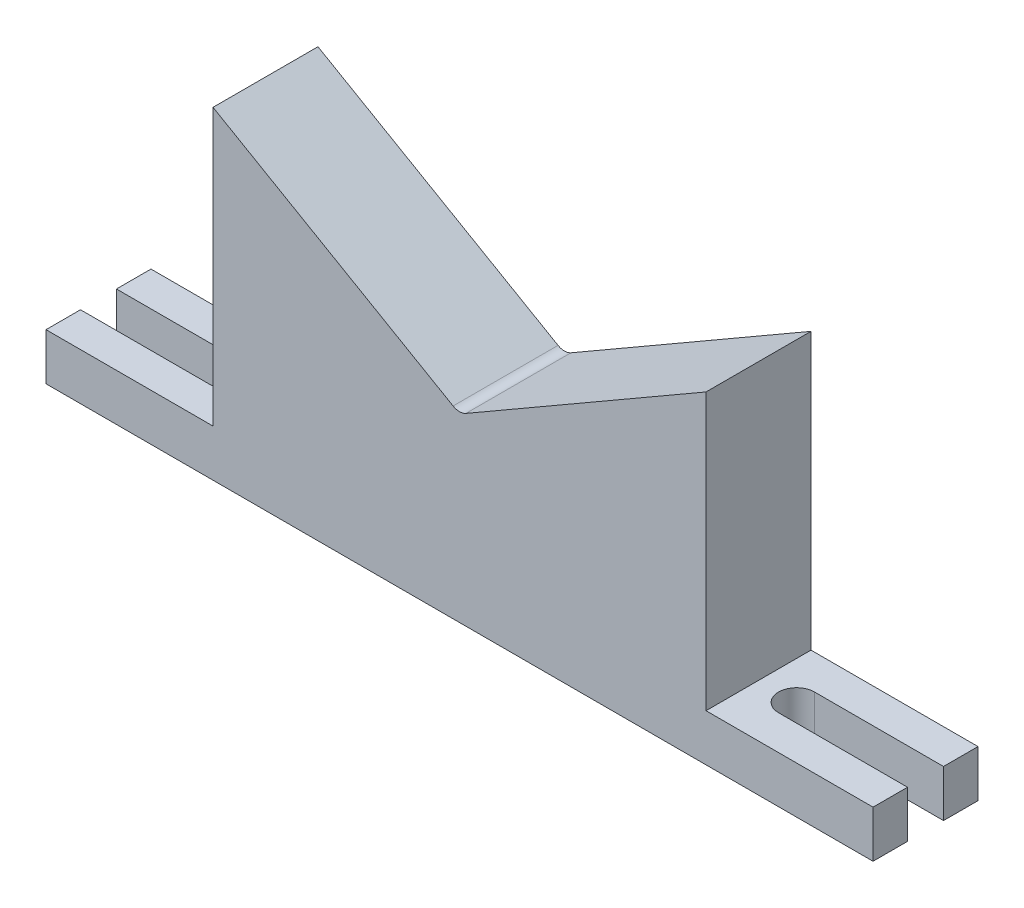
ISO-10303-21;
HEADER;
FILE_DESCRIPTION(('STEP AP214'),'2;1');
FILE_NAME('part.step','',(''),(''),'','','');
FILE_SCHEMA(('AUTOMOTIVE_DESIGN { 1 0 10303 214 1 1 1 1 }'));
ENDSEC;
DATA;
#1=APPLICATION_CONTEXT('core data for automotive mechanical design processes');
#2=APPLICATION_PROTOCOL_DEFINITION('international standard','automotive_design',2000,#1);
#3=PRODUCT_CONTEXT('',#1,'mechanical');
#4=PRODUCT('Part','Part','',(#3));
#5=PRODUCT_RELATED_PRODUCT_CATEGORY('part','',(#4));
#6=PRODUCT_DEFINITION_FORMATION('','',#4);
#7=PRODUCT_DEFINITION_CONTEXT('part definition',#1,'design');
#8=PRODUCT_DEFINITION('design','',#6,#7);
#9=PRODUCT_DEFINITION_SHAPE('','',#8);
#10=(LENGTH_UNIT() NAMED_UNIT(*) SI_UNIT(.MILLI.,.METRE.));
#11=(NAMED_UNIT(*) PLANE_ANGLE_UNIT() SI_UNIT($,.RADIAN.));
#12=(NAMED_UNIT(*) SI_UNIT($,.STERADIAN.) SOLID_ANGLE_UNIT());
#13=UNCERTAINTY_MEASURE_WITH_UNIT(LENGTH_MEASURE(1.E-05),#10,'distance_accuracy_value','');
#14=(GEOMETRIC_REPRESENTATION_CONTEXT(3) GLOBAL_UNCERTAINTY_ASSIGNED_CONTEXT((#13)) GLOBAL_UNIT_ASSIGNED_CONTEXT((#10,
#11,#12)) REPRESENTATION_CONTEXT('',''));
#15=CARTESIAN_POINT('',(0.,0.,0.));
#16=DIRECTION('',(0.,0.,1.));
#17=DIRECTION('',(1.,0.,0.));
#18=AXIS2_PLACEMENT_3D('',#15,#16,#17);
#19=CARTESIAN_POINT('',(-81.755,-26.4434746458796,20.7518));
#20=DIRECTION('',(1.,0.,0.));
#21=DIRECTION('',(0.,0.,-1.));
#22=AXIS2_PLACEMENT_3D('',#19,#20,#21);
#23=PLANE('',#22);
#24=DIRECTION('',(0.,1.,0.));
#25=VECTOR('',#24,1.);
#26=CARTESIAN_POINT('',(-81.755,-36.4434746458796,13.9319));
#27=LINE('',#26,#25);
#28=CARTESIAN_POINT('',(-81.755,-35.7144746458478,13.9319));
#29=VERTEX_POINT('',#28);
#30=CARTESIAN_POINT('',(-81.755,-26.4434746458796,13.9319));
#31=VERTEX_POINT('',#30);
#32=EDGE_CURVE('E189',#29,#31,#27,.T.);
#33=ORIENTED_EDGE('',*,*,#32,.F.);
#34=DIRECTION('',(0.,0.,-1.));
#35=VECTOR('',#34,1.);
#36=CARTESIAN_POINT('',(-81.755,-35.7144746458796,20.7518));
#37=LINE('',#36,#35);
#38=CARTESIAN_POINT('',(-81.755,-35.7144746458796,20.7518));
#39=VERTEX_POINT('',#38);
#40=EDGE_CURVE('E317',#39,#29,#37,.T.);
#41=ORIENTED_EDGE('',*,*,#40,.F.);
#42=DIRECTION('',(0.,-1.,0.));
#43=VECTOR('',#42,1.);
#44=CARTESIAN_POINT('',(-81.755,-26.4434746458796,20.7518));
#45=LINE('',#44,#43);
#46=CARTESIAN_POINT('',(-81.755,-26.4434746458796,20.7518));
#47=VERTEX_POINT('',#46);
#48=EDGE_CURVE('E250',#47,#39,#45,.T.);
#49=ORIENTED_EDGE('',*,*,#48,.F.);
#50=DIRECTION('',(0.,0.,-1.));
#51=VECTOR('',#50,1.);
#52=CARTESIAN_POINT('',(-81.755,-26.4434746458796,20.7518));
#53=LINE('',#52,#51);
#54=EDGE_CURVE('E322',#47,#31,#53,.T.);
#55=ORIENTED_EDGE('',*,*,#54,.T.);
#56=EDGE_LOOP('',(#33,#41,#49,#55));
#57=FACE_BOUND('',#56,.T.);
#58=ADVANCED_FACE('F43',(#57),#23,.F.);
#59=CARTESIAN_POINT('',(81.755,-26.4434746458796,20.7518));
#60=DIRECTION('',(-1.,0.,0.));
#61=DIRECTION('',(0.,0.,1.));
#62=AXIS2_PLACEMENT_3D('',#59,#60,#61);
#63=PLANE('',#62);
#64=DIRECTION('',(0.,1.,0.));
#65=VECTOR('',#64,1.);
#66=CARTESIAN_POINT('',(81.755,-36.4434746458795,6.81990000000003));
#67=LINE('',#66,#65);
#68=CARTESIAN_POINT('',(81.755,-35.7144746458769,6.81990000000003));
#69=VERTEX_POINT('',#68);
#70=CARTESIAN_POINT('',(81.755,-26.4434746458795,6.81990000000003));
#71=VERTEX_POINT('',#70);
#72=EDGE_CURVE('E229',#69,#71,#67,.T.);
#73=ORIENTED_EDGE('',*,*,#72,.F.);
#74=DIRECTION('',(0.,0.,-1.));
#75=VECTOR('',#74,1.);
#76=CARTESIAN_POINT('',(81.755,-35.7144746458796,20.7518));
#77=LINE('',#76,#75);
#78=CARTESIAN_POINT('',(81.755,-35.7144746458796,0.));
#79=VERTEX_POINT('',#78);
#80=EDGE_CURVE('E311',#69,#79,#77,.T.);
#81=ORIENTED_EDGE('',*,*,#80,.T.);
#82=DIRECTION('',(0.,1.,0.));
#83=VECTOR('',#82,1.);
#84=CARTESIAN_POINT('',(81.755,-26.4434746458796,0.));
#85=LINE('',#84,#83);
#86=CARTESIAN_POINT('',(81.755,-26.4434746458796,0.));
#87=VERTEX_POINT('',#86);
#88=EDGE_CURVE('E284',#79,#87,#85,.T.);
#89=ORIENTED_EDGE('',*,*,#88,.T.);
#90=DIRECTION('',(0.,0.,-1.));
#91=VECTOR('',#90,1.);
#92=CARTESIAN_POINT('',(81.755,-26.4434746458796,20.7518));
#93=LINE('',#92,#91);
#94=EDGE_CURVE('E306',#71,#87,#93,.T.);
#95=ORIENTED_EDGE('',*,*,#94,.F.);
#96=EDGE_LOOP('',(#73,#81,#89,#95));
#97=FACE_BOUND('',#96,.T.);
#98=ADVANCED_FACE('F385',(#97),#63,.F.);
#99=CARTESIAN_POINT('',(-48.735,-26.4434746458796,20.7518));
#100=DIRECTION('',(0.,-1.,0.));
#101=DIRECTION('',(1.,0.,0.));
#102=AXIS2_PLACEMENT_3D('',#99,#100,#101);
#103=PLANE('',#102);
#104=DIRECTION('',(1.,0.,0.));
#105=VECTOR('',#104,1.);
#106=CARTESIAN_POINT('',(0.,-26.4434746458795,13.9318999999999));
#107=LINE('',#106,#105);
#108=CARTESIAN_POINT('',(-56.2570838122828,-26.4434746458796,13.9319));
#109=VERTEX_POINT('',#108);
#110=EDGE_CURVE('E184',#31,#109,#107,.T.);
#111=ORIENTED_EDGE('',*,*,#110,.F.);
#112=ORIENTED_EDGE('',*,*,#54,.F.);
#113=DIRECTION('',(-1.,0.,0.));
#114=VECTOR('',#113,1.);
#115=CARTESIAN_POINT('',(-48.735,-26.4434746458796,20.7518));
#116=LINE('',#115,#114);
#117=CARTESIAN_POINT('',(-48.735,-26.4434746458796,20.7518));
#118=VERTEX_POINT('',#117);
#119=EDGE_CURVE('E245',#118,#47,#116,.T.);
#120=ORIENTED_EDGE('',*,*,#119,.F.);
#121=DIRECTION('',(0.,0.,-1.));
#122=VECTOR('',#121,1.);
#123=CARTESIAN_POINT('',(-48.735,-26.4434746458796,20.7518));
#124=LINE('',#123,#122);
#125=CARTESIAN_POINT('',(-48.735,-26.4434746458796,0.));
#126=VERTEX_POINT('',#125);
#127=EDGE_CURVE('E330',#118,#126,#124,.T.);
#128=ORIENTED_EDGE('',*,*,#127,.T.);
#129=DIRECTION('',(-1.,0.,0.));
#130=VECTOR('',#129,1.);
#131=CARTESIAN_POINT('',(-48.735,-26.4434746458796,0.));
#132=LINE('',#131,#130);
#133=CARTESIAN_POINT('',(-81.755,-26.4434746458796,0.));
#134=VERTEX_POINT('',#133);
#135=EDGE_CURVE('E271',#126,#134,#132,.T.);
#136=ORIENTED_EDGE('',*,*,#135,.T.);
#137=CARTESIAN_POINT('',(-81.755,-26.4434746458796,6.81990000000004));
#138=VERTEX_POINT('',#137);
#139=EDGE_CURVE('E323',#138,#134,#53,.T.);
#140=ORIENTED_EDGE('',*,*,#139,.F.);
#141=DIRECTION('',(1.,0.,0.));
#142=VECTOR('',#141,1.);
#143=CARTESIAN_POINT('',(0.,-26.4434746458795,6.81990000000016));
#144=LINE('',#143,#142);
#145=CARTESIAN_POINT('',(-56.2570838122828,-26.4434746458796,6.81990000000008));
#146=VERTEX_POINT('',#145);
#147=EDGE_CURVE('E182',#138,#146,#144,.T.);
#148=ORIENTED_EDGE('',*,*,#147,.T.);
#149=CARTESIAN_POINT('',(-56.2570838122828,-26.4434746458796,10.3759));
#150=DIRECTION('',(0.,1.,0.));
#151=DIRECTION('',(-1.,0.,0.));
#152=AXIS2_PLACEMENT_3D('',#149,#150,#151);
#153=CIRCLE('',#152,3.55599999999994);
#154=EDGE_CURVE('E175',#109,#146,#153,.T.);
#155=ORIENTED_EDGE('',*,*,#154,.F.);
#156=EDGE_LOOP('',(#111,#112,#120,#128,#136,#140,#148,#155));
#157=FACE_BOUND('',#156,.T.);
#158=ADVANCED_FACE('F191',(#157),#103,.F.);
#159=CARTESIAN_POINT('',(48.735,-26.4434746458796,20.7518));
#160=DIRECTION('',(0.,-1.,0.));
#161=DIRECTION('',(1.,0.,0.));
#162=AXIS2_PLACEMENT_3D('',#159,#160,#161);
#163=PLANE('',#162);
#164=CARTESIAN_POINT('',(81.755,-26.4434746458796,20.7518));
#165=VERTEX_POINT('',#164);
#166=CARTESIAN_POINT('',(81.755,-26.4434746458795,13.9319));
#167=VERTEX_POINT('',#166);
#168=EDGE_CURVE('E310',#165,#167,#93,.T.);
#169=ORIENTED_EDGE('',*,*,#168,.T.);
#170=DIRECTION('',(-1.,0.,0.));
#171=VECTOR('',#170,1.);
#172=CARTESIAN_POINT('',(0.,-26.4434746458795,13.9318999999999));
#173=LINE('',#172,#171);
#174=CARTESIAN_POINT('',(56.2570838122828,-26.4434746458795,13.9318999999999));
#175=VERTEX_POINT('',#174);
#176=EDGE_CURVE('E216',#167,#175,#173,.T.);
#177=ORIENTED_EDGE('',*,*,#176,.T.);
#178=CARTESIAN_POINT('',(56.2570838122828,-26.4434746458795,10.3759));
#179=DIRECTION('',(0.,1.,0.));
#180=DIRECTION('',(-1.,0.,0.));
#181=AXIS2_PLACEMENT_3D('',#178,#179,#180);
#182=CIRCLE('',#181,3.55599999999994);
#183=CARTESIAN_POINT('',(56.2570838122828,-26.4434746458796,6.81990000000004));
#184=VERTEX_POINT('',#183);
#185=EDGE_CURVE('E215',#175,#184,#182,.F.);
#186=ORIENTED_EDGE('',*,*,#185,.T.);
#187=DIRECTION('',(-1.,0.,0.));
#188=VECTOR('',#187,1.);
#189=CARTESIAN_POINT('',(0.,-26.4434746458795,6.81990000000013));
#190=LINE('',#189,#188);
#191=EDGE_CURVE('E219',#71,#184,#190,.T.);
#192=ORIENTED_EDGE('',*,*,#191,.F.);
#193=ORIENTED_EDGE('',*,*,#94,.T.);
#194=DIRECTION('',(-1.,0.,0.));
#195=VECTOR('',#194,1.);
#196=CARTESIAN_POINT('',(48.735,-26.4434746458796,0.));
#197=LINE('',#196,#195);
#198=CARTESIAN_POINT('',(48.735,-26.4434746458796,0.));
#199=VERTEX_POINT('',#198);
#200=EDGE_CURVE('E287',#87,#199,#197,.T.);
#201=ORIENTED_EDGE('',*,*,#200,.T.);
#202=DIRECTION('',(0.,0.,-1.));
#203=VECTOR('',#202,1.);
#204=CARTESIAN_POINT('',(48.735,-26.4434746458796,20.7518));
#205=LINE('',#204,#203);
#206=CARTESIAN_POINT('',(48.735,-26.4434746458796,20.7518));
#207=VERTEX_POINT('',#206);
#208=EDGE_CURVE('E301',#207,#199,#205,.T.);
#209=ORIENTED_EDGE('',*,*,#208,.F.);
#210=DIRECTION('',(-1.,0.,0.));
#211=VECTOR('',#210,1.);
#212=CARTESIAN_POINT('',(48.735,-26.4434746458796,20.7518));
#213=LINE('',#212,#211);
#214=EDGE_CURVE('E258',#165,#207,#213,.T.);
#215=ORIENTED_EDGE('',*,*,#214,.F.);
#216=EDGE_LOOP('',(#169,#177,#186,#192,#193,#201,#209,#215));
#217=FACE_BOUND('',#216,.T.);
#218=ADVANCED_FACE('F400',(#217),#163,.F.);
#219=CARTESIAN_POINT('',(-48.735,-26.4434746458796,20.7518));
#220=DIRECTION('',(1.,0.,0.));
#221=DIRECTION('',(0.,0.,-1.));
#222=AXIS2_PLACEMENT_3D('',#219,#220,#221);
#223=PLANE('',#222);
#224=DIRECTION('',(0.,-1.,0.));
#225=VECTOR('',#224,1.);
#226=CARTESIAN_POINT('',(-48.735,-26.4434746458796,0.));
#227=LINE('',#226,#225);
#228=CARTESIAN_POINT('',(-48.735,28.1371653689567,0.));
#229=VERTEX_POINT('',#228);
#230=EDGE_CURVE('E236',#229,#126,#227,.T.);
#231=ORIENTED_EDGE('',*,*,#230,.T.);
#232=ORIENTED_EDGE('',*,*,#127,.F.);
#233=DIRECTION('',(0.,-1.,0.));
#234=VECTOR('',#233,1.);
#235=CARTESIAN_POINT('',(-48.735,-26.4434746458796,20.7518));
#236=LINE('',#235,#234);
#237=CARTESIAN_POINT('',(-48.735,28.1371653689567,20.7518));
#238=VERTEX_POINT('',#237);
#239=EDGE_CURVE('E239',#238,#118,#236,.T.);
#240=ORIENTED_EDGE('',*,*,#239,.F.);
#241=DIRECTION('',(0.,0.,-1.));
#242=VECTOR('',#241,1.);
#243=CARTESIAN_POINT('',(-48.735,28.1371653689567,20.7518));
#244=LINE('',#243,#242);
#245=EDGE_CURVE('E270',#238,#229,#244,.T.);
#246=ORIENTED_EDGE('',*,*,#245,.T.);
#247=EDGE_LOOP('',(#231,#232,#240,#246));
#248=FACE_BOUND('',#247,.T.);
#249=ADVANCED_FACE('F395',(#248),#223,.F.);
#250=CARTESIAN_POINT('',(-81.755,-35.7144746458478,6.81990000000004));
#251=VERTEX_POINT('',#250);
#252=CARTESIAN_POINT('',(-81.755,-35.7144746458796,0.));
#253=VERTEX_POINT('',#252);
#254=EDGE_CURVE('E318',#251,#253,#37,.T.);
#255=ORIENTED_EDGE('',*,*,#254,.F.);
#256=DIRECTION('',(0.,1.,0.));
#257=VECTOR('',#256,1.);
#258=CARTESIAN_POINT('',(-81.755,-36.4434746458796,6.81990000000004));
#259=LINE('',#258,#257);
#260=EDGE_CURVE('E206',#251,#138,#259,.T.);
#261=ORIENTED_EDGE('',*,*,#260,.T.);
#262=ORIENTED_EDGE('',*,*,#139,.T.);
#263=DIRECTION('',(0.,-1.,0.));
#264=VECTOR('',#263,1.);
#265=CARTESIAN_POINT('',(-81.755,-26.4434746458796,0.));
#266=LINE('',#265,#264);
#267=EDGE_CURVE('E274',#134,#253,#266,.T.);
#268=ORIENTED_EDGE('',*,*,#267,.T.);
#269=EDGE_LOOP('',(#255,#261,#262,#268));
#270=FACE_BOUND('',#269,.T.);
#271=ADVANCED_FACE('F359',(#270),#23,.F.);
#272=CARTESIAN_POINT('',(81.6230375021819,-35.7144746458795,20.7518));
#273=DIRECTION('',(2.10329268349371E-13,1.,0.));
#274=DIRECTION('',(-1.,2.10329268349372E-13,0.));
#275=AXIS2_PLACEMENT_3D('',#272,#273,#274);
#276=PLANE('',#275);
#277=ORIENTED_EDGE('',*,*,#40,.T.);
#278=DIRECTION('',(1.,-2.10329268349372E-13,0.));
#279=VECTOR('',#278,1.);
#280=CARTESIAN_POINT('',(81.6230375021819,-35.7144746458795,13.9318999999999));
#281=LINE('',#280,#279);
#282=CARTESIAN_POINT('',(-56.2570838122828,-35.7144746458498,13.9319));
#283=VERTEX_POINT('',#282);
#284=EDGE_CURVE('E341',#29,#283,#281,.T.);
#285=ORIENTED_EDGE('',*,*,#284,.T.);
#286=CARTESIAN_POINT('',(-56.2570838122828,-35.7144746458505,10.3759));
#287=DIRECTION('',(2.10329268349371E-13,1.,0.));
#288=DIRECTION('',(-1.,2.10329268349372E-13,0.));
#289=AXIS2_PLACEMENT_3D('',#286,#287,#288);
#290=CIRCLE('',#289,3.55599999999994);
#291=CARTESIAN_POINT('',(-56.2570838122828,-35.7144746458505,6.81990000000005));
#292=VERTEX_POINT('',#291);
#293=EDGE_CURVE('E177',#283,#292,#290,.T.);
#294=ORIENTED_EDGE('',*,*,#293,.T.);
#295=DIRECTION('',(1.,-2.10329268349372E-13,0.));
#296=VECTOR('',#295,1.);
#297=CARTESIAN_POINT('',(81.623037502182,-35.7144746458795,6.81990000000028));
#298=LINE('',#297,#296);
#299=EDGE_CURVE('E338',#251,#292,#298,.T.);
#300=ORIENTED_EDGE('',*,*,#299,.F.);
#301=ORIENTED_EDGE('',*,*,#254,.T.);
#302=DIRECTION('',(1.,-2.10329268349372E-13,0.));
#303=VECTOR('',#302,1.);
#304=CARTESIAN_POINT('',(81.6230375021819,-35.7144746458795,0.));
#305=LINE('',#304,#303);
#306=EDGE_CURVE('E279',#253,#79,#305,.T.);
#307=ORIENTED_EDGE('',*,*,#306,.T.);
#308=ORIENTED_EDGE('',*,*,#80,.F.);
#309=DIRECTION('',(-1.,2.10329268349372E-13,0.));
#310=VECTOR('',#309,1.);
#311=CARTESIAN_POINT('',(81.6230375021819,-35.7144746458795,6.81990000000003));
#312=LINE('',#311,#310);
#313=CARTESIAN_POINT('',(56.2570838122828,-35.7144746458769,6.81990000000006));
#314=VERTEX_POINT('',#313);
#315=EDGE_CURVE('E331',#69,#314,#312,.T.);
#316=ORIENTED_EDGE('',*,*,#315,.T.);
#317=CARTESIAN_POINT('',(56.2570838122828,-35.7144746458742,10.3759));
#318=DIRECTION('',(2.10329268349371E-13,1.,0.));
#319=DIRECTION('',(-1.,2.10329268349372E-13,0.));
#320=AXIS2_PLACEMENT_3D('',#317,#318,#319);
#321=CIRCLE('',#320,3.55599999999994);
#322=CARTESIAN_POINT('',(56.2570838122828,-35.7144746458769,13.9318999999999));
#323=VERTEX_POINT('',#322);
#324=EDGE_CURVE('E202',#323,#314,#321,.F.);
#325=ORIENTED_EDGE('',*,*,#324,.F.);
#326=DIRECTION('',(-1.,2.10329268349372E-13,0.));
#327=VECTOR('',#326,1.);
#328=CARTESIAN_POINT('',(81.6230375021819,-35.7144746458795,13.9319));
#329=LINE('',#328,#327);
#330=CARTESIAN_POINT('',(81.755,-35.7144746458769,13.9319));
#331=VERTEX_POINT('',#330);
#332=EDGE_CURVE('E332',#331,#323,#329,.T.);
#333=ORIENTED_EDGE('',*,*,#332,.F.);
#334=CARTESIAN_POINT('',(81.755,-35.7144746458796,20.7518));
#335=VERTEX_POINT('',#334);
#336=EDGE_CURVE('E314',#335,#331,#77,.T.);
#337=ORIENTED_EDGE('',*,*,#336,.F.);
#338=DIRECTION('',(1.,2.10329268349372E-13,0.));
#339=VECTOR('',#338,1.);
#340=CARTESIAN_POINT('',(-81.6230375021819,-35.7144746458795,20.7518));
#341=LINE('',#340,#339);
#342=EDGE_CURVE('E248',#39,#335,#341,.T.);
#343=ORIENTED_EDGE('',*,*,#342,.F.);
#344=EDGE_LOOP('',(#277,#285,#294,#300,#301,#307,#308,#316,#325,#333,#337,#343));
#345=FACE_BOUND('',#344,.T.);
#346=ADVANCED_FACE('F366',(#345),#276,.F.);
#347=ORIENTED_EDGE('',*,*,#336,.T.);
#348=DIRECTION('',(0.,1.,0.));
#349=VECTOR('',#348,1.);
#350=CARTESIAN_POINT('',(81.755,-36.4434746458795,13.9319));
#351=LINE('',#350,#349);
#352=EDGE_CURVE('E228',#331,#167,#351,.T.);
#353=ORIENTED_EDGE('',*,*,#352,.T.);
#354=ORIENTED_EDGE('',*,*,#168,.F.);
#355=DIRECTION('',(0.,1.,0.));
#356=VECTOR('',#355,1.);
#357=CARTESIAN_POINT('',(81.755,-26.4434746458796,20.7518));
#358=LINE('',#357,#356);
#359=EDGE_CURVE('E251',#335,#165,#358,.T.);
#360=ORIENTED_EDGE('',*,*,#359,.F.);
#361=EDGE_LOOP('',(#347,#353,#354,#360));
#362=FACE_BOUND('',#361,.T.);
#363=ADVANCED_FACE('F386',(#362),#63,.F.);
#364=CARTESIAN_POINT('',(48.735,-26.4434746458796,20.7518));
#365=DIRECTION('',(-1.,0.,0.));
#366=DIRECTION('',(0.,0.,1.));
#367=AXIS2_PLACEMENT_3D('',#364,#365,#366);
#368=PLANE('',#367);
#369=DIRECTION('',(0.,1.,0.));
#370=VECTOR('',#369,1.);
#371=CARTESIAN_POINT('',(48.735,-26.4434746458796,0.));
#372=LINE('',#371,#370);
#373=CARTESIAN_POINT('',(48.735,28.1371653689568,0.));
#374=VERTEX_POINT('',#373);
#375=EDGE_CURVE('E286',#199,#374,#372,.T.);
#376=ORIENTED_EDGE('',*,*,#375,.T.);
#377=DIRECTION('',(0.,0.,-1.));
#378=VECTOR('',#377,1.);
#379=CARTESIAN_POINT('',(48.735,28.1371653689568,20.7518));
#380=LINE('',#379,#378);
#381=CARTESIAN_POINT('',(48.735,28.1371653689568,20.7518));
#382=VERTEX_POINT('',#381);
#383=EDGE_CURVE('E298',#382,#374,#380,.T.);
#384=ORIENTED_EDGE('',*,*,#383,.F.);
#385=DIRECTION('',(0.,1.,0.));
#386=VECTOR('',#385,1.);
#387=CARTESIAN_POINT('',(48.735,-26.4434746458796,20.7518));
#388=LINE('',#387,#386);
#389=EDGE_CURVE('E259',#207,#382,#388,.T.);
#390=ORIENTED_EDGE('',*,*,#389,.F.);
#391=ORIENTED_EDGE('',*,*,#208,.T.);
#392=EDGE_LOOP('',(#376,#384,#390,#391));
#393=FACE_BOUND('',#392,.T.);
#394=ADVANCED_FACE('F435',(#393),#368,.F.);
#395=CARTESIAN_POINT('',(48.735,28.1371653689568,20.7518));
#396=DIRECTION('',(0.500000000000004,-0.866025403784436,0.));
#397=DIRECTION('',(0.866025403784436,0.500000000000004,0.));
#398=AXIS2_PLACEMENT_3D('',#395,#396,#397);
#399=PLANE('',#398);
#400=DIRECTION('',(-0.866025403784436,-0.500000000000005,0.));
#401=VECTOR('',#400,1.);
#402=CARTESIAN_POINT('',(48.735,28.1371653689568,0.));
#403=LINE('',#402,#401);
#404=CARTESIAN_POINT('',(1.26999999999999,0.733234841870833,0.));
#405=VERTEX_POINT('',#404);
#406=EDGE_CURVE('E295',#374,#405,#403,.T.);
#407=ORIENTED_EDGE('',*,*,#406,.T.);
#408=DIRECTION('',(0.,0.,-1.));
#409=VECTOR('',#408,1.);
#410=CARTESIAN_POINT('',(1.27,0.733234841870842,20.7518));
#411=LINE('',#410,#409);
#412=CARTESIAN_POINT('',(1.26999999999999,0.733234841870833,20.7518));
#413=VERTEX_POINT('',#412);
#414=EDGE_CURVE('E56',#405,#413,#411,.F.);
#415=ORIENTED_EDGE('',*,*,#414,.T.);
#416=DIRECTION('',(-0.866025403784436,-0.500000000000005,0.));
#417=VECTOR('',#416,1.);
#418=CARTESIAN_POINT('',(48.735,28.1371653689568,20.7518));
#419=LINE('',#418,#417);
#420=EDGE_CURVE('E261',#382,#413,#419,.T.);
#421=ORIENTED_EDGE('',*,*,#420,.F.);
#422=ORIENTED_EDGE('',*,*,#383,.T.);
#423=EDGE_LOOP('',(#407,#415,#421,#422));
#424=FACE_BOUND('',#423,.T.);
#425=ADVANCED_FACE('F487',(#424),#399,.F.);
#426=CARTESIAN_POINT('',(-48.735,28.1371653689567,20.7518));
#427=DIRECTION('',(-0.500000000000004,-0.866025403784436,0.));
#428=DIRECTION('',(0.866025403784436,-0.500000000000004,0.));
#429=AXIS2_PLACEMENT_3D('',#426,#427,#428);
#430=PLANE('',#429);
#431=DIRECTION('',(-0.866025403784436,0.500000000000004,0.));
#432=VECTOR('',#431,1.);
#433=CARTESIAN_POINT('',(-48.735,28.1371653689567,20.7518));
#434=LINE('',#433,#432);
#435=CARTESIAN_POINT('',(-1.27000000000002,0.733234841870843,20.7518));
#436=VERTEX_POINT('',#435);
#437=EDGE_CURVE('E262',#436,#238,#434,.T.);
#438=ORIENTED_EDGE('',*,*,#437,.F.);
#439=DIRECTION('',(0.,0.,-1.));
#440=VECTOR('',#439,1.);
#441=CARTESIAN_POINT('',(-1.27000000000002,0.733234841870842,0.));
#442=LINE('',#441,#440);
#443=CARTESIAN_POINT('',(-1.27000000000002,0.733234841870843,0.));
#444=VERTEX_POINT('',#443);
#445=EDGE_CURVE('E350',#436,#444,#442,.T.);
#446=ORIENTED_EDGE('',*,*,#445,.T.);
#447=DIRECTION('',(-0.866025403784436,0.500000000000004,0.));
#448=VECTOR('',#447,1.);
#449=CARTESIAN_POINT('',(-48.735,28.1371653689567,0.));
#450=LINE('',#449,#448);
#451=EDGE_CURVE('E241',#444,#229,#450,.T.);
#452=ORIENTED_EDGE('',*,*,#451,.T.);
#453=ORIENTED_EDGE('',*,*,#245,.F.);
#454=EDGE_LOOP('',(#438,#446,#452,#453));
#455=FACE_BOUND('',#454,.T.);
#456=ADVANCED_FACE('F493',(#455),#430,.F.);
#457=CARTESIAN_POINT('',(0.,0.,20.7518));
#458=DIRECTION('',(0.,0.,-1.));
#459=DIRECTION('',(-1.,0.,0.));
#460=AXIS2_PLACEMENT_3D('',#457,#458,#459);
#461=PLANE('',#460);
#462=ORIENTED_EDGE('',*,*,#239,.T.);
#463=ORIENTED_EDGE('',*,*,#119,.T.);
#464=ORIENTED_EDGE('',*,*,#48,.T.);
#465=ORIENTED_EDGE('',*,*,#342,.T.);
#466=ORIENTED_EDGE('',*,*,#359,.T.);
#467=ORIENTED_EDGE('',*,*,#214,.T.);
#468=ORIENTED_EDGE('',*,*,#389,.T.);
#469=ORIENTED_EDGE('',*,*,#420,.T.);
#470=CARTESIAN_POINT('',(0.,2.93293936748331,20.7518));
#471=DIRECTION('',(0.,0.,-1.));
#472=DIRECTION('',(-1.,0.,0.));
#473=AXIS2_PLACEMENT_3D('',#470,#471,#472);
#474=CIRCLE('',#473,2.54);
#475=EDGE_CURVE('E11',#413,#436,#474,.T.);
#476=ORIENTED_EDGE('',*,*,#475,.T.);
#477=ORIENTED_EDGE('',*,*,#437,.T.);
#478=EDGE_LOOP('',(#462,#463,#464,#465,#466,#467,#468,#469,#476,#477));
#479=FACE_BOUND('',#478,.T.);
#480=ADVANCED_FACE('F505',(#479),#461,.F.);
#481=CARTESIAN_POINT('',(0.,0.,0.));
#482=DIRECTION('',(0.,0.,-1.));
#483=DIRECTION('',(-1.,0.,0.));
#484=AXIS2_PLACEMENT_3D('',#481,#482,#483);
#485=PLANE('',#484);
#486=ORIENTED_EDGE('',*,*,#230,.F.);
#487=ORIENTED_EDGE('',*,*,#451,.F.);
#488=CARTESIAN_POINT('',(0.,2.93293936748331,0.));
#489=DIRECTION('',(0.,0.,-1.));
#490=DIRECTION('',(-1.,0.,0.));
#491=AXIS2_PLACEMENT_3D('',#488,#489,#490);
#492=CIRCLE('',#491,2.54);
#493=EDGE_CURVE('E55',#444,#405,#492,.F.);
#494=ORIENTED_EDGE('',*,*,#493,.T.);
#495=ORIENTED_EDGE('',*,*,#406,.F.);
#496=ORIENTED_EDGE('',*,*,#375,.F.);
#497=ORIENTED_EDGE('',*,*,#200,.F.);
#498=ORIENTED_EDGE('',*,*,#88,.F.);
#499=ORIENTED_EDGE('',*,*,#306,.F.);
#500=ORIENTED_EDGE('',*,*,#267,.F.);
#501=ORIENTED_EDGE('',*,*,#135,.F.);
#502=EDGE_LOOP('',(#486,#487,#494,#495,#496,#497,#498,#499,#500,#501));
#503=FACE_BOUND('',#502,.T.);
#504=ADVANCED_FACE('F361',(#503),#485,.T.);
#505=CARTESIAN_POINT('',(0.,-36.4434746458795,6.81990000000013));
#506=DIRECTION('',(0.,0.,-1.));
#507=DIRECTION('',(-1.,0.,0.));
#508=AXIS2_PLACEMENT_3D('',#505,#506,#507);
#509=PLANE('',#508);
#510=ORIENTED_EDGE('',*,*,#72,.T.);
#511=ORIENTED_EDGE('',*,*,#191,.T.);
#512=DIRECTION('',(0.,1.,0.));
#513=VECTOR('',#512,1.);
#514=CARTESIAN_POINT('',(56.2570838122828,-36.4434746458795,6.81990000000006));
#515=LINE('',#514,#513);
#516=EDGE_CURVE('E195',#314,#184,#515,.T.);
#517=ORIENTED_EDGE('',*,*,#516,.F.);
#518=ORIENTED_EDGE('',*,*,#315,.F.);
#519=EDGE_LOOP('',(#510,#511,#517,#518));
#520=FACE_BOUND('',#519,.T.);
#521=ADVANCED_FACE('F438',(#520),#509,.F.);
#522=CARTESIAN_POINT('',(0.,-36.4434746458795,13.9318999999999));
#523=DIRECTION('',(0.,0.,-1.));
#524=DIRECTION('',(-1.,0.,0.));
#525=AXIS2_PLACEMENT_3D('',#522,#523,#524);
#526=PLANE('',#525);
#527=ORIENTED_EDGE('',*,*,#332,.T.);
#528=DIRECTION('',(0.,1.,0.));
#529=VECTOR('',#528,1.);
#530=CARTESIAN_POINT('',(56.2570838122828,-36.4434746458795,13.9318999999999));
#531=LINE('',#530,#529);
#532=EDGE_CURVE('E224',#323,#175,#531,.T.);
#533=ORIENTED_EDGE('',*,*,#532,.T.);
#534=ORIENTED_EDGE('',*,*,#176,.F.);
#535=ORIENTED_EDGE('',*,*,#352,.F.);
#536=EDGE_LOOP('',(#527,#533,#534,#535));
#537=FACE_BOUND('',#536,.T.);
#538=ADVANCED_FACE('F441',(#537),#526,.T.);
#539=CARTESIAN_POINT('',(56.2570838122828,-36.4434746458795,10.3759));
#540=DIRECTION('',(0.,1.,0.));
#541=DIRECTION('',(-1.,0.,0.));
#542=AXIS2_PLACEMENT_3D('',#539,#540,#541);
#543=CYLINDRICAL_SURFACE('',#542,3.55599999999994);
#544=ORIENTED_EDGE('',*,*,#324,.T.);
#545=ORIENTED_EDGE('',*,*,#516,.T.);
#546=ORIENTED_EDGE('',*,*,#185,.F.);
#547=ORIENTED_EDGE('',*,*,#532,.F.);
#548=EDGE_LOOP('',(#544,#545,#546,#547));
#549=FACE_BOUND('',#548,.T.);
#550=ADVANCED_FACE('F377',(#549),#543,.F.);
#551=CARTESIAN_POINT('',(0.,-36.4434746458795,13.9318999999999));
#552=DIRECTION('',(0.,0.,1.));
#553=DIRECTION('',(1.,0.,0.));
#554=AXIS2_PLACEMENT_3D('',#551,#552,#553);
#555=PLANE('',#554);
#556=ORIENTED_EDGE('',*,*,#32,.T.);
#557=ORIENTED_EDGE('',*,*,#110,.T.);
#558=DIRECTION('',(0.,1.,0.));
#559=VECTOR('',#558,1.);
#560=CARTESIAN_POINT('',(-56.2570838122828,-36.4434746458796,13.9319));
#561=LINE('',#560,#559);
#562=EDGE_CURVE('E166',#283,#109,#561,.T.);
#563=ORIENTED_EDGE('',*,*,#562,.F.);
#564=ORIENTED_EDGE('',*,*,#284,.F.);
#565=EDGE_LOOP('',(#556,#557,#563,#564));
#566=FACE_BOUND('',#565,.T.);
#567=ADVANCED_FACE('F183',(#566),#555,.F.);
#568=CARTESIAN_POINT('',(0.,-36.4434746458795,6.81990000000016));
#569=DIRECTION('',(0.,0.,1.));
#570=DIRECTION('',(1.,0.,0.));
#571=AXIS2_PLACEMENT_3D('',#568,#569,#570);
#572=PLANE('',#571);
#573=ORIENTED_EDGE('',*,*,#299,.T.);
#574=DIRECTION('',(0.,1.,0.));
#575=VECTOR('',#574,1.);
#576=CARTESIAN_POINT('',(-56.2570838122828,-36.4434746458796,6.81990000000008));
#577=LINE('',#576,#575);
#578=EDGE_CURVE('E178',#292,#146,#577,.T.);
#579=ORIENTED_EDGE('',*,*,#578,.T.);
#580=ORIENTED_EDGE('',*,*,#147,.F.);
#581=ORIENTED_EDGE('',*,*,#260,.F.);
#582=EDGE_LOOP('',(#573,#579,#580,#581));
#583=FACE_BOUND('',#582,.T.);
#584=ADVANCED_FACE('F375',(#583),#572,.T.);
#585=CARTESIAN_POINT('',(-56.2570838122828,-36.4434746458796,10.3759));
#586=DIRECTION('',(0.,1.,0.));
#587=DIRECTION('',(-1.,0.,0.));
#588=AXIS2_PLACEMENT_3D('',#585,#586,#587);
#589=CYLINDRICAL_SURFACE('',#588,3.55599999999994);
#590=ORIENTED_EDGE('',*,*,#562,.T.);
#591=ORIENTED_EDGE('',*,*,#154,.T.);
#592=ORIENTED_EDGE('',*,*,#578,.F.);
#593=ORIENTED_EDGE('',*,*,#293,.F.);
#594=EDGE_LOOP('',(#590,#591,#592,#593));
#595=FACE_BOUND('',#594,.T.);
#596=ADVANCED_FACE('F172',(#595),#589,.F.);
#597=CARTESIAN_POINT('',(0.,2.93293936748331,20.7518));
#598=DIRECTION('',(0.,0.,1.));
#599=DIRECTION('',(1.,0.,0.));
#600=AXIS2_PLACEMENT_3D('',#597,#598,#599);
#601=CYLINDRICAL_SURFACE('',#600,2.54);
#602=ORIENTED_EDGE('',*,*,#475,.F.);
#603=ORIENTED_EDGE('',*,*,#414,.F.);
#604=ORIENTED_EDGE('',*,*,#493,.F.);
#605=ORIENTED_EDGE('',*,*,#445,.F.);
#606=EDGE_LOOP('',(#602,#603,#604,#605));
#607=FACE_BOUND('',#606,.T.);
#608=ADVANCED_FACE('F44',(#607),#601,.F.);
#609=CLOSED_SHELL('',(#58,#98,#158,#218,#249,#271,#346,#363,#394,#425,#456,#480,#504,#521,#538,
#550,#567,#584,#596,#608));
#610=MANIFOLD_SOLID_BREP('B2',#609);
#611=ADVANCED_BREP_SHAPE_REPRESENTATION('',(#18,#610),#14);
#612=SHAPE_DEFINITION_REPRESENTATION(#9,#611);
ENDSEC;
END-ISO-10303-21;
